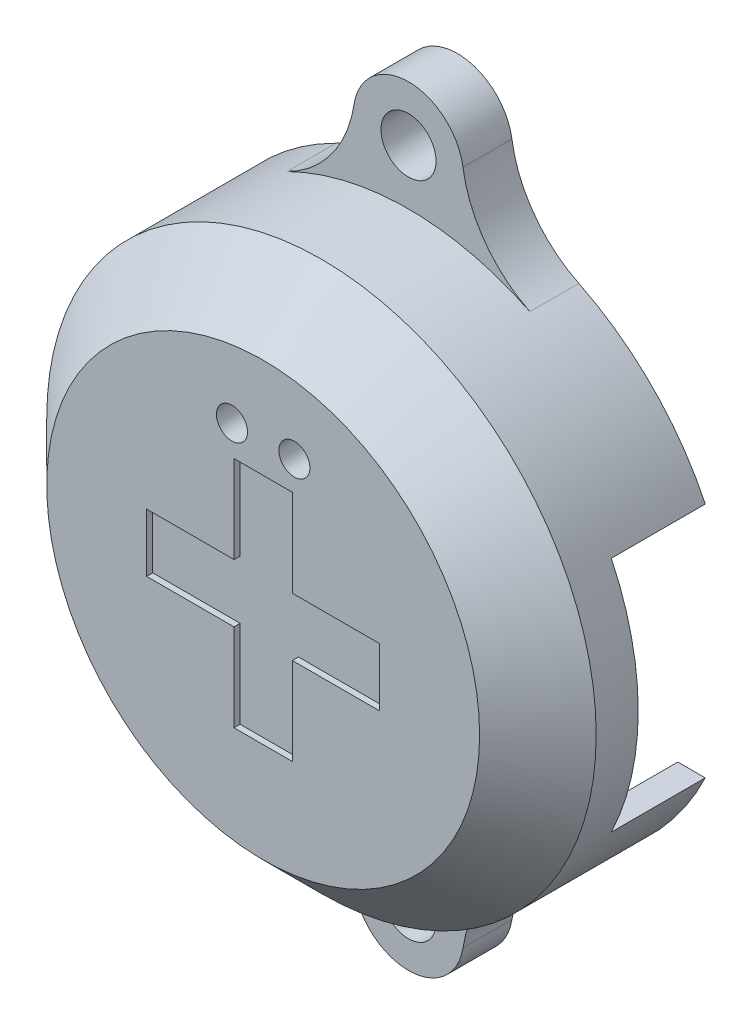
ISO-10303-21;
HEADER;
FILE_DESCRIPTION(('STEP AP214'),'2;1');
FILE_NAME('part.step','',(''),(''),'','','');
FILE_SCHEMA(('AUTOMOTIVE_DESIGN { 1 0 10303 214 1 1 1 1 }'));
ENDSEC;
DATA;
#1=APPLICATION_CONTEXT('core data for automotive mechanical design processes');
#2=APPLICATION_PROTOCOL_DEFINITION('international standard','automotive_design',2000,#1);
#3=PRODUCT_CONTEXT('',#1,'mechanical');
#4=PRODUCT('Part','Part','',(#3));
#5=PRODUCT_RELATED_PRODUCT_CATEGORY('part','',(#4));
#6=PRODUCT_DEFINITION_FORMATION('','',#4);
#7=PRODUCT_DEFINITION_CONTEXT('part definition',#1,'design');
#8=PRODUCT_DEFINITION('design','',#6,#7);
#9=PRODUCT_DEFINITION_SHAPE('','',#8);
#10=(LENGTH_UNIT() NAMED_UNIT(*) SI_UNIT(.MILLI.,.METRE.));
#11=(NAMED_UNIT(*) PLANE_ANGLE_UNIT() SI_UNIT($,.RADIAN.));
#12=(NAMED_UNIT(*) SI_UNIT($,.STERADIAN.) SOLID_ANGLE_UNIT());
#13=UNCERTAINTY_MEASURE_WITH_UNIT(LENGTH_MEASURE(1.E-05),#10,'distance_accuracy_value','');
#14=(GEOMETRIC_REPRESENTATION_CONTEXT(3) GLOBAL_UNCERTAINTY_ASSIGNED_CONTEXT((#13)) GLOBAL_UNIT_ASSIGNED_CONTEXT((#10,
#11,#12)) REPRESENTATION_CONTEXT('',''));
#15=CARTESIAN_POINT('',(0.,0.,0.));
#16=DIRECTION('',(0.,0.,1.));
#17=DIRECTION('',(1.,0.,0.));
#18=AXIS2_PLACEMENT_3D('',#15,#16,#17);
#19=CARTESIAN_POINT('',(0.,0.,0.));
#20=DIRECTION('',(0.,0.,1.));
#21=DIRECTION('',(1.,0.,0.));
#22=AXIS2_PLACEMENT_3D('',#19,#20,#21);
#23=PLANE('',#22);
#24=CARTESIAN_POINT('',(0.,-26.95,0.));
#25=DIRECTION('',(0.,0.,1.));
#26=DIRECTION('',(1.,0.,0.));
#27=AXIS2_PLACEMENT_3D('',#24,#25,#26);
#28=CIRCLE('',#27,2.25);
#29=CARTESIAN_POINT('',(2.25,-26.95,0.));
#30=VERTEX_POINT('',#29);
#31=EDGE_CURVE('E448',#30,#30,#28,.T.);
#32=ORIENTED_EDGE('',*,*,#31,.T.);
#33=EDGE_LOOP('',(#32));
#34=FACE_BOUND('',#33,.T.);
#35=CARTESIAN_POINT('',(-6.60464318228082E-12,3.48582322548716E-13,0.));
#36=DIRECTION('',(0.,0.,1.));
#37=DIRECTION('',(1.,0.,0.));
#38=AXIS2_PLACEMENT_3D('',#35,#36,#37);
#39=CIRCLE('',#38,22.45);
#40=CARTESIAN_POINT('',(-20.2515623841763,-9.68900000000403,0.));
#41=VERTEX_POINT('',#40);
#42=CARTESIAN_POINT('',(-9.9196082532792,-20.1396095320042,0.));
#43=VERTEX_POINT('',#42);
#44=EDGE_CURVE('E273',#41,#43,#39,.T.);
#45=ORIENTED_EDGE('',*,*,#44,.F.);
#46=DIRECTION('',(1.,0.,0.));
#47=VECTOR('',#46,1.);
#48=CARTESIAN_POINT('',(-22.4500000000066,-9.68900000000403,0.));
#49=LINE('',#48,#47);
#50=CARTESIAN_POINT('',(-18.0090471430377,-9.68900000000403,0.));
#51=VERTEX_POINT('',#50);
#52=EDGE_CURVE('E333',#41,#51,#49,.T.);
#53=ORIENTED_EDGE('',*,*,#52,.T.);
#54=CARTESIAN_POINT('',(-6.60464318228082E-12,3.48582322548716E-13,0.));
#55=DIRECTION('',(0.,0.,1.));
#56=DIRECTION('',(1.,0.,0.));
#57=AXIS2_PLACEMENT_3D('',#54,#55,#56);
#58=CIRCLE('',#57,20.45);
#59=CARTESIAN_POINT('',(18.0090471430245,-9.68900000000403,0.));
#60=VERTEX_POINT('',#59);
#61=EDGE_CURVE('E415',#51,#60,#58,.T.);
#62=ORIENTED_EDGE('',*,*,#61,.T.);
#63=CARTESIAN_POINT('',(20.251562384163,-9.68900000000403,0.));
#64=VERTEX_POINT('',#63);
#65=EDGE_CURVE('E320',#60,#64,#49,.T.);
#66=ORIENTED_EDGE('',*,*,#65,.T.);
#67=CARTESIAN_POINT('',(-6.60464318228082E-12,3.48582322548716E-13,0.));
#68=DIRECTION('',(0.,0.,1.));
#69=DIRECTION('',(1.,0.,0.));
#70=AXIS2_PLACEMENT_3D('',#67,#68,#69);
#71=CIRCLE('',#70,22.45);
#72=CARTESIAN_POINT('',(9.91960825326625,-20.139609532004,0.));
#73=VERTEX_POINT('',#72);
#74=EDGE_CURVE('E479',#73,#64,#71,.T.);
#75=ORIENTED_EDGE('',*,*,#74,.F.);
#76=CARTESIAN_POINT('',(14.3381419963722,-29.1104823747677,0.));
#77=DIRECTION('',(0.,0.,1.));
#78=DIRECTION('',(1.,0.,0.));
#79=AXIS2_PLACEMENT_3D('',#76,#77,#78);
#80=CIRCLE('',#79,10.);
#81=CARTESIAN_POINT('',(4.44976820576625,-27.6204945301001,0.));
#82=VERTEX_POINT('',#81);
#83=EDGE_CURVE('E468',#73,#82,#80,.T.);
#84=ORIENTED_EDGE('',*,*,#83,.T.);
#85=CARTESIAN_POINT('',(-6.42729412120925E-12,-26.9499999999997,0.));
#86=DIRECTION('',(0.,0.,1.));
#87=DIRECTION('',(1.,0.,0.));
#88=AXIS2_PLACEMENT_3D('',#85,#86,#87);
#89=CIRCLE('',#88,4.5);
#90=CARTESIAN_POINT('',(-4.4497682057791,-27.6204945301001,0.));
#91=VERTEX_POINT('',#90);
#92=EDGE_CURVE('E276',#91,#82,#89,.T.);
#93=ORIENTED_EDGE('',*,*,#92,.F.);
#94=CARTESIAN_POINT('',(-14.338141996385,-29.1104823747678,0.));
#95=DIRECTION('',(0.,0.,1.));
#96=DIRECTION('',(1.,0.,0.));
#97=AXIS2_PLACEMENT_3D('',#94,#95,#96);
#98=CIRCLE('',#97,9.99999999999999);
#99=EDGE_CURVE('E272',#91,#43,#98,.T.);
#100=ORIENTED_EDGE('',*,*,#99,.T.);
#101=EDGE_LOOP('',(#45,#53,#62,#66,#75,#84,#93,#100));
#102=FACE_BOUND('',#101,.T.);
#103=ADVANCED_FACE('F58',(#34,#102),#23,.F.);
#104=CARTESIAN_POINT('',(20.2515623841672,9.68899999999595,0.));
#105=VERTEX_POINT('',#104);
#106=CARTESIAN_POINT('',(9.91960825326599,20.1396095320049,0.));
#107=VERTEX_POINT('',#106);
#108=EDGE_CURVE('E478',#105,#107,#71,.T.);
#109=ORIENTED_EDGE('',*,*,#108,.F.);
#110=DIRECTION('',(1.,0.,0.));
#111=VECTOR('',#110,1.);
#112=CARTESIAN_POINT('',(-22.4500000000066,9.68899999999596,0.));
#113=LINE('',#112,#111);
#114=CARTESIAN_POINT('',(18.0090471430292,9.68899999999595,0.));
#115=VERTEX_POINT('',#114);
#116=EDGE_CURVE('E266',#115,#105,#113,.T.);
#117=ORIENTED_EDGE('',*,*,#116,.F.);
#118=CARTESIAN_POINT('',(-18.0090471430424,9.68899999999596,0.));
#119=VERTEX_POINT('',#118);
#120=EDGE_CURVE('E265',#115,#119,#58,.T.);
#121=ORIENTED_EDGE('',*,*,#120,.T.);
#122=CARTESIAN_POINT('',(-20.2515623841805,9.68899999999595,0.));
#123=VERTEX_POINT('',#122);
#124=EDGE_CURVE('E84',#123,#119,#113,.T.);
#125=ORIENTED_EDGE('',*,*,#124,.F.);
#126=CARTESIAN_POINT('',(-9.91960825327948,20.1396095320047,0.));
#127=VERTEX_POINT('',#126);
#128=EDGE_CURVE('E261',#127,#123,#39,.T.);
#129=ORIENTED_EDGE('',*,*,#128,.F.);
#130=CARTESIAN_POINT('',(-14.3381419963854,29.1104823747683,0.));
#131=DIRECTION('',(0.,0.,1.));
#132=DIRECTION('',(1.,0.,0.));
#133=AXIS2_PLACEMENT_3D('',#130,#131,#132);
#134=CIRCLE('',#133,10.);
#135=CARTESIAN_POINT('',(-4.44976820577948,27.6204945301008,0.));
#136=VERTEX_POINT('',#135);
#137=EDGE_CURVE('E278',#127,#136,#134,.T.);
#138=ORIENTED_EDGE('',*,*,#137,.T.);
#139=CARTESIAN_POINT('',(-6.79531640052712E-12,26.9500000000004,0.));
#140=DIRECTION('',(0.,0.,1.));
#141=DIRECTION('',(1.,0.,0.));
#142=AXIS2_PLACEMENT_3D('',#139,#140,#141);
#143=CIRCLE('',#142,4.5);
#144=CARTESIAN_POINT('',(4.44976820576588,27.6204945301008,0.));
#145=VERTEX_POINT('',#144);
#146=EDGE_CURVE('E483',#145,#136,#143,.T.);
#147=ORIENTED_EDGE('',*,*,#146,.F.);
#148=CARTESIAN_POINT('',(14.3381419963718,29.1104823747685,0.));
#149=DIRECTION('',(0.,0.,1.));
#150=DIRECTION('',(1.,0.,0.));
#151=AXIS2_PLACEMENT_3D('',#148,#149,#150);
#152=CIRCLE('',#151,9.99999999999999);
#153=EDGE_CURVE('E481',#145,#107,#152,.T.);
#154=ORIENTED_EDGE('',*,*,#153,.T.);
#155=EDGE_LOOP('',(#109,#117,#121,#125,#129,#138,#147,#154));
#156=FACE_BOUND('',#155,.T.);
#157=CARTESIAN_POINT('',(-6.79531640052712E-12,26.9500000000004,0.));
#158=DIRECTION('',(0.,0.,1.));
#159=DIRECTION('',(1.,0.,0.));
#160=AXIS2_PLACEMENT_3D('',#157,#158,#159);
#161=CIRCLE('',#160,2.25);
#162=CARTESIAN_POINT('',(2.2499999999932,26.9500000000004,0.));
#163=VERTEX_POINT('',#162);
#164=EDGE_CURVE('E454',#163,#163,#161,.T.);
#165=ORIENTED_EDGE('',*,*,#164,.T.);
#166=EDGE_LOOP('',(#165));
#167=FACE_BOUND('',#166,.T.);
#168=ADVANCED_FACE('F258',(#156,#167),#23,.F.);
#169=CARTESIAN_POINT('',(14.3381419963722,-29.1104823747677,15.875));
#170=DIRECTION('',(0.,0.,-1.));
#171=DIRECTION('',(-1.,0.,0.));
#172=AXIS2_PLACEMENT_3D('',#169,#170,#171);
#173=CYLINDRICAL_SURFACE('',#172,10.);
#174=DIRECTION('',(0.,0.,-1.));
#175=VECTOR('',#174,1.);
#176=CARTESIAN_POINT('',(9.91960825326625,-20.139609532004,15.875));
#177=LINE('',#176,#175);
#178=CARTESIAN_POINT('',(9.91960825326625,-20.139609532004,4.));
#179=VERTEX_POINT('',#178);
#180=EDGE_CURVE('E299',#179,#73,#177,.T.);
#181=ORIENTED_EDGE('',*,*,#180,.F.);
#182=CARTESIAN_POINT('',(14.3381419963722,-29.1104823747677,4.));
#183=DIRECTION('',(0.,0.,1.));
#184=DIRECTION('',(1.,0.,0.));
#185=AXIS2_PLACEMENT_3D('',#182,#183,#184);
#186=CIRCLE('',#185,10.);
#187=CARTESIAN_POINT('',(4.44976820576625,-27.6204945301001,4.));
#188=VERTEX_POINT('',#187);
#189=EDGE_CURVE('E465',#188,#179,#186,.F.);
#190=ORIENTED_EDGE('',*,*,#189,.F.);
#191=DIRECTION('',(0.,0.,-1.));
#192=VECTOR('',#191,1.);
#193=CARTESIAN_POINT('',(4.44976820576625,-27.6204945301001,15.875));
#194=LINE('',#193,#192);
#195=EDGE_CURVE('E284',#188,#82,#194,.T.);
#196=ORIENTED_EDGE('',*,*,#195,.T.);
#197=ORIENTED_EDGE('',*,*,#83,.F.);
#198=EDGE_LOOP('',(#181,#190,#196,#197));
#199=FACE_BOUND('',#198,.T.);
#200=ADVANCED_FACE('F532',(#199),#173,.F.);
#201=CARTESIAN_POINT('',(14.3381419963718,29.1104823747685,15.875));
#202=DIRECTION('',(0.,0.,-1.));
#203=DIRECTION('',(-1.,0.,0.));
#204=AXIS2_PLACEMENT_3D('',#201,#202,#203);
#205=CYLINDRICAL_SURFACE('',#204,9.99999999999999);
#206=DIRECTION('',(0.,0.,-1.));
#207=VECTOR('',#206,1.);
#208=CARTESIAN_POINT('',(4.44976820576588,27.6204945301008,15.875));
#209=LINE('',#208,#207);
#210=CARTESIAN_POINT('',(4.44976820576588,27.6204945301008,4.));
#211=VERTEX_POINT('',#210);
#212=EDGE_CURVE('E294',#211,#145,#209,.T.);
#213=ORIENTED_EDGE('',*,*,#212,.F.);
#214=CARTESIAN_POINT('',(14.3381419963718,29.1104823747685,4.));
#215=DIRECTION('',(0.,0.,1.));
#216=DIRECTION('',(1.,0.,0.));
#217=AXIS2_PLACEMENT_3D('',#214,#215,#216);
#218=CIRCLE('',#217,9.99999999999999);
#219=CARTESIAN_POINT('',(9.91960825326599,20.1396095320049,4.));
#220=VERTEX_POINT('',#219);
#221=EDGE_CURVE('E470',#220,#211,#218,.F.);
#222=ORIENTED_EDGE('',*,*,#221,.F.);
#223=DIRECTION('',(0.,0.,-1.));
#224=VECTOR('',#223,1.);
#225=CARTESIAN_POINT('',(9.91960825326599,20.1396095320049,15.875));
#226=LINE('',#225,#224);
#227=EDGE_CURVE('E296',#220,#107,#226,.T.);
#228=ORIENTED_EDGE('',*,*,#227,.T.);
#229=ORIENTED_EDGE('',*,*,#153,.F.);
#230=EDGE_LOOP('',(#213,#222,#228,#229));
#231=FACE_BOUND('',#230,.T.);
#232=ADVANCED_FACE('F498',(#231),#205,.F.);
#233=CARTESIAN_POINT('',(-6.79531640052712E-12,26.9500000000004,15.875));
#234=DIRECTION('',(0.,0.,-1.));
#235=DIRECTION('',(-1.,0.,0.));
#236=AXIS2_PLACEMENT_3D('',#233,#234,#235);
#237=CYLINDRICAL_SURFACE('',#236,4.5);
#238=CARTESIAN_POINT('',(-6.79531640052712E-12,26.9500000000004,4.));
#239=DIRECTION('',(0.,0.,1.));
#240=DIRECTION('',(1.,0.,0.));
#241=AXIS2_PLACEMENT_3D('',#238,#239,#240);
#242=CIRCLE('',#241,4.5);
#243=CARTESIAN_POINT('',(-4.44976820577947,27.6204945301008,4.));
#244=VERTEX_POINT('',#243);
#245=EDGE_CURVE('E472',#211,#244,#242,.T.);
#246=ORIENTED_EDGE('',*,*,#245,.F.);
#247=ORIENTED_EDGE('',*,*,#212,.T.);
#248=ORIENTED_EDGE('',*,*,#146,.T.);
#249=DIRECTION('',(0.,0.,-1.));
#250=VECTOR('',#249,1.);
#251=CARTESIAN_POINT('',(-4.44976820577948,27.6204945301008,15.875));
#252=LINE('',#251,#250);
#253=EDGE_CURVE('E292',#244,#136,#252,.T.);
#254=ORIENTED_EDGE('',*,*,#253,.F.);
#255=EDGE_LOOP('',(#246,#247,#248,#254));
#256=FACE_BOUND('',#255,.T.);
#257=ADVANCED_FACE('F493',(#256),#237,.T.);
#258=CARTESIAN_POINT('',(-14.3381419963854,29.1104823747683,15.875));
#259=DIRECTION('',(0.,0.,-1.));
#260=DIRECTION('',(-1.,0.,0.));
#261=AXIS2_PLACEMENT_3D('',#258,#259,#260);
#262=CYLINDRICAL_SURFACE('',#261,10.);
#263=DIRECTION('',(0.,0.,-1.));
#264=VECTOR('',#263,1.);
#265=CARTESIAN_POINT('',(-9.91960825327948,20.1396095320047,15.875));
#266=LINE('',#265,#264);
#267=CARTESIAN_POINT('',(-9.91960825327948,20.1396095320047,4.));
#268=VERTEX_POINT('',#267);
#269=EDGE_CURVE('E271',#268,#127,#266,.T.);
#270=ORIENTED_EDGE('',*,*,#269,.F.);
#271=CARTESIAN_POINT('',(-14.3381419963854,29.1104823747683,4.));
#272=DIRECTION('',(0.,0.,1.));
#273=DIRECTION('',(1.,0.,0.));
#274=AXIS2_PLACEMENT_3D('',#271,#272,#273);
#275=CIRCLE('',#274,10.);
#276=EDGE_CURVE('E461',#244,#268,#275,.F.);
#277=ORIENTED_EDGE('',*,*,#276,.F.);
#278=ORIENTED_EDGE('',*,*,#253,.T.);
#279=ORIENTED_EDGE('',*,*,#137,.F.);
#280=EDGE_LOOP('',(#270,#277,#278,#279));
#281=FACE_BOUND('',#280,.T.);
#282=ADVANCED_FACE('F490',(#281),#262,.F.);
#283=CARTESIAN_POINT('',(-14.338141996385,-29.1104823747678,15.875));
#284=DIRECTION('',(0.,0.,-1.));
#285=DIRECTION('',(-1.,0.,0.));
#286=AXIS2_PLACEMENT_3D('',#283,#284,#285);
#287=CYLINDRICAL_SURFACE('',#286,9.99999999999999);
#288=DIRECTION('',(0.,0.,-1.));
#289=VECTOR('',#288,1.);
#290=CARTESIAN_POINT('',(-4.4497682057791,-27.6204945301001,15.875));
#291=LINE('',#290,#289);
#292=CARTESIAN_POINT('',(-4.4497682057791,-27.6204945301001,4.));
#293=VERTEX_POINT('',#292);
#294=EDGE_CURVE('E286',#293,#91,#291,.T.);
#295=ORIENTED_EDGE('',*,*,#294,.F.);
#296=CARTESIAN_POINT('',(-14.338141996385,-29.1104823747678,4.));
#297=DIRECTION('',(0.,0.,1.));
#298=DIRECTION('',(1.,0.,0.));
#299=AXIS2_PLACEMENT_3D('',#296,#297,#298);
#300=CIRCLE('',#299,9.99999999999999);
#301=CARTESIAN_POINT('',(-9.91960825327921,-20.1396095320042,4.));
#302=VERTEX_POINT('',#301);
#303=EDGE_CURVE('E460',#302,#293,#300,.F.);
#304=ORIENTED_EDGE('',*,*,#303,.F.);
#305=DIRECTION('',(0.,0.,-1.));
#306=VECTOR('',#305,1.);
#307=CARTESIAN_POINT('',(-9.9196082532792,-20.1396095320042,15.875));
#308=LINE('',#307,#306);
#309=EDGE_CURVE('E288',#302,#43,#308,.T.);
#310=ORIENTED_EDGE('',*,*,#309,.T.);
#311=ORIENTED_EDGE('',*,*,#99,.F.);
#312=EDGE_LOOP('',(#295,#304,#310,#311));
#313=FACE_BOUND('',#312,.T.);
#314=ADVANCED_FACE('F539',(#313),#287,.F.);
#315=CARTESIAN_POINT('',(-6.42729412120925E-12,-26.9499999999997,15.875));
#316=DIRECTION('',(0.,0.,-1.));
#317=DIRECTION('',(-1.,0.,0.));
#318=AXIS2_PLACEMENT_3D('',#315,#316,#317);
#319=CYLINDRICAL_SURFACE('',#318,4.5);
#320=CARTESIAN_POINT('',(-6.42729412120925E-12,-26.9499999999997,4.));
#321=DIRECTION('',(0.,0.,1.));
#322=DIRECTION('',(1.,0.,0.));
#323=AXIS2_PLACEMENT_3D('',#320,#321,#322);
#324=CIRCLE('',#323,4.5);
#325=EDGE_CURVE('E463',#293,#188,#324,.T.);
#326=ORIENTED_EDGE('',*,*,#325,.F.);
#327=ORIENTED_EDGE('',*,*,#294,.T.);
#328=ORIENTED_EDGE('',*,*,#92,.T.);
#329=ORIENTED_EDGE('',*,*,#195,.F.);
#330=EDGE_LOOP('',(#326,#327,#328,#329));
#331=FACE_BOUND('',#330,.T.);
#332=ADVANCED_FACE('F544',(#331),#319,.T.);
#333=CARTESIAN_POINT('',(0.,0.,15.875));
#334=DIRECTION('',(0.,0.,1.));
#335=DIRECTION('',(1.,0.,0.));
#336=AXIS2_PLACEMENT_3D('',#333,#334,#335);
#337=PLANE('',#336);
#338=CARTESIAN_POINT('',(2.55000000000583,11.9500000000043,15.875));
#339=DIRECTION('',(0.,0.,1.));
#340=DIRECTION('',(1.,0.,0.));
#341=AXIS2_PLACEMENT_3D('',#338,#339,#340);
#342=CIRCLE('',#341,1.26999999999451);
#343=CARTESIAN_POINT('',(3.82000000000034,11.9500000000043,15.875));
#344=VERTEX_POINT('',#343);
#345=EDGE_CURVE('E316',#344,#344,#342,.T.);
#346=ORIENTED_EDGE('',*,*,#345,.F.);
#347=EDGE_LOOP('',(#346));
#348=FACE_BOUND('',#347,.T.);
#349=CARTESIAN_POINT('',(-2.54999999999417,11.9500000000043,15.875));
#350=DIRECTION('',(0.,0.,1.));
#351=DIRECTION('',(1.,0.,0.));
#352=AXIS2_PLACEMENT_3D('',#349,#350,#351);
#353=CIRCLE('',#352,1.26999999999451);
#354=CARTESIAN_POINT('',(-1.27999999999966,11.9500000000043,15.875));
#355=VERTEX_POINT('',#354);
#356=EDGE_CURVE('E322',#355,#355,#353,.T.);
#357=ORIENTED_EDGE('',*,*,#356,.F.);
#358=EDGE_LOOP('',(#357));
#359=FACE_BOUND('',#358,.T.);
#360=DIRECTION('',(1.,0.,0.));
#361=VECTOR('',#360,1.);
#362=CARTESIAN_POINT('',(0.,-2.38125,15.875));
#363=LINE('',#362,#361);
#364=CARTESIAN_POINT('',(-9.525,-2.38125,15.875));
#365=VERTEX_POINT('',#364);
#366=CARTESIAN_POINT('',(-2.38125,-2.38125,15.875));
#367=VERTEX_POINT('',#366);
#368=EDGE_CURVE('E347',#365,#367,#363,.T.);
#369=ORIENTED_EDGE('',*,*,#368,.F.);
#370=DIRECTION('',(0.,-1.,0.));
#371=VECTOR('',#370,1.);
#372=CARTESIAN_POINT('',(-9.525,0.,15.875));
#373=LINE('',#372,#371);
#374=CARTESIAN_POINT('',(-9.525,2.38125,15.875));
#375=VERTEX_POINT('',#374);
#376=EDGE_CURVE('E352',#375,#365,#373,.T.);
#377=ORIENTED_EDGE('',*,*,#376,.F.);
#378=DIRECTION('',(1.,0.,0.));
#379=VECTOR('',#378,1.);
#380=CARTESIAN_POINT('',(0.,2.38125,15.875));
#381=LINE('',#380,#379);
#382=CARTESIAN_POINT('',(-2.38125,2.38125,15.875));
#383=VERTEX_POINT('',#382);
#384=EDGE_CURVE('E408',#375,#383,#381,.T.);
#385=ORIENTED_EDGE('',*,*,#384,.T.);
#386=DIRECTION('',(0.,-1.,0.));
#387=VECTOR('',#386,1.);
#388=CARTESIAN_POINT('',(-2.38125,0.,15.875));
#389=LINE('',#388,#387);
#390=CARTESIAN_POINT('',(-2.38125,9.525,15.875));
#391=VERTEX_POINT('',#390);
#392=EDGE_CURVE('E405',#391,#383,#389,.T.);
#393=ORIENTED_EDGE('',*,*,#392,.F.);
#394=DIRECTION('',(1.,0.,0.));
#395=VECTOR('',#394,1.);
#396=CARTESIAN_POINT('',(0.,9.525,15.875));
#397=LINE('',#396,#395);
#398=CARTESIAN_POINT('',(2.38125,9.525,15.875));
#399=VERTEX_POINT('',#398);
#400=EDGE_CURVE('E402',#391,#399,#397,.T.);
#401=ORIENTED_EDGE('',*,*,#400,.T.);
#402=DIRECTION('',(0.,-1.,0.));
#403=VECTOR('',#402,1.);
#404=CARTESIAN_POINT('',(2.38125,0.,15.875));
#405=LINE('',#404,#403);
#406=CARTESIAN_POINT('',(2.38125,2.38125,15.875));
#407=VERTEX_POINT('',#406);
#408=EDGE_CURVE('E399',#399,#407,#405,.T.);
#409=ORIENTED_EDGE('',*,*,#408,.T.);
#410=DIRECTION('',(1.,0.,0.));
#411=VECTOR('',#410,1.);
#412=CARTESIAN_POINT('',(0.,2.38125,15.875));
#413=LINE('',#412,#411);
#414=CARTESIAN_POINT('',(9.525,2.38125,15.875));
#415=VERTEX_POINT('',#414);
#416=EDGE_CURVE('E396',#407,#415,#413,.T.);
#417=ORIENTED_EDGE('',*,*,#416,.T.);
#418=DIRECTION('',(0.,-1.,0.));
#419=VECTOR('',#418,1.);
#420=CARTESIAN_POINT('',(9.525,0.,15.875));
#421=LINE('',#420,#419);
#422=CARTESIAN_POINT('',(9.525,-2.38125,15.875));
#423=VERTEX_POINT('',#422);
#424=EDGE_CURVE('E393',#415,#423,#421,.T.);
#425=ORIENTED_EDGE('',*,*,#424,.T.);
#426=DIRECTION('',(1.,0.,0.));
#427=VECTOR('',#426,1.);
#428=CARTESIAN_POINT('',(0.,-2.38125,15.875));
#429=LINE('',#428,#427);
#430=CARTESIAN_POINT('',(2.38125,-2.38125,15.875));
#431=VERTEX_POINT('',#430);
#432=EDGE_CURVE('E390',#431,#423,#429,.T.);
#433=ORIENTED_EDGE('',*,*,#432,.F.);
#434=DIRECTION('',(0.,-1.,0.));
#435=VECTOR('',#434,1.);
#436=CARTESIAN_POINT('',(2.38125,0.,15.875));
#437=LINE('',#436,#435);
#438=CARTESIAN_POINT('',(2.38125,-9.525,15.875));
#439=VERTEX_POINT('',#438);
#440=EDGE_CURVE('E387',#431,#439,#437,.T.);
#441=ORIENTED_EDGE('',*,*,#440,.T.);
#442=DIRECTION('',(1.,0.,0.));
#443=VECTOR('',#442,1.);
#444=CARTESIAN_POINT('',(0.,-9.525,15.875));
#445=LINE('',#444,#443);
#446=CARTESIAN_POINT('',(-2.38125,-9.525,15.875));
#447=VERTEX_POINT('',#446);
#448=EDGE_CURVE('E384',#447,#439,#445,.T.);
#449=ORIENTED_EDGE('',*,*,#448,.F.);
#450=DIRECTION('',(0.,-1.,0.));
#451=VECTOR('',#450,1.);
#452=CARTESIAN_POINT('',(-2.38125,0.,15.875));
#453=LINE('',#452,#451);
#454=EDGE_CURVE('E381',#367,#447,#453,.T.);
#455=ORIENTED_EDGE('',*,*,#454,.F.);
#456=EDGE_LOOP('',(#369,#377,#385,#393,#401,#409,#417,#425,#433,#441,#449,#455));
#457=FACE_BOUND('',#456,.T.);
#458=CARTESIAN_POINT('',(-6.60464318228082E-12,3.48582322548716E-13,15.875));
#459=DIRECTION('',(0.,0.,1.));
#460=DIRECTION('',(1.,0.,0.));
#461=AXIS2_PLACEMENT_3D('',#458,#459,#460);
#462=CIRCLE('',#461,17.6875);
#463=CARTESIAN_POINT('',(17.6874999999934,3.48582322548716E-13,15.875));
#464=VERTEX_POINT('',#463);
#465=EDGE_CURVE('E301',#464,#464,#462,.T.);
#466=ORIENTED_EDGE('',*,*,#465,.T.);
#467=EDGE_LOOP('',(#466));
#468=FACE_BOUND('',#467,.T.);
#469=ADVANCED_FACE('F546',(#348,#359,#457,#468),#337,.T.);
#470=CARTESIAN_POINT('',(-6.60464318228082E-12,3.48582322548716E-13,15.875));
#471=DIRECTION('',(0.,0.,-1.));
#472=DIRECTION('',(-1.,0.,0.));
#473=AXIS2_PLACEMENT_3D('',#470,#471,#472);
#474=CYLINDRICAL_SURFACE('',#473,22.45);
#475=CARTESIAN_POINT('',(-6.60464318228082E-12,3.48582322548716E-13,11.1125));
#476=DIRECTION('',(0.,0.,1.));
#477=DIRECTION('',(1.,0.,0.));
#478=AXIS2_PLACEMENT_3D('',#475,#476,#477);
#479=CIRCLE('',#478,22.45);
#480=CARTESIAN_POINT('',(22.4499999999934,3.48582322548716E-13,11.1125));
#481=VERTEX_POINT('',#480);
#482=EDGE_CURVE('E304',#481,#481,#479,.F.);
#483=ORIENTED_EDGE('',*,*,#482,.T.);
#484=EDGE_LOOP('',(#483));
#485=FACE_BOUND('',#484,.T.);
#486=ORIENTED_EDGE('',*,*,#74,.T.);
#487=DIRECTION('',(0.,0.,-1.));
#488=VECTOR('',#487,1.);
#489=CARTESIAN_POINT('',(20.251562384163,-9.68900000000403,15.875));
#490=LINE('',#489,#488);
#491=CARTESIAN_POINT('',(20.251562384163,-9.68900000000403,7.67679999999568));
#492=VERTEX_POINT('',#491);
#493=EDGE_CURVE('E341',#64,#492,#490,.F.);
#494=ORIENTED_EDGE('',*,*,#493,.T.);
#495=CARTESIAN_POINT('',(-6.60464318228082E-12,3.48582322548716E-13,7.67679999999568));
#496=DIRECTION('',(0.,0.,1.));
#497=DIRECTION('',(0.,-1.,0.));
#498=AXIS2_PLACEMENT_3D('',#495,#496,#497);
#499=CIRCLE('',#498,22.45);
#500=CARTESIAN_POINT('',(20.2515623841672,9.68899999999596,7.67679999999568));
#501=VERTEX_POINT('',#500);
#502=EDGE_CURVE('E339',#492,#501,#499,.T.);
#503=ORIENTED_EDGE('',*,*,#502,.T.);
#504=DIRECTION('',(0.,0.,-1.));
#505=VECTOR('',#504,1.);
#506=CARTESIAN_POINT('',(20.2515623841672,9.68899999999595,15.875));
#507=LINE('',#506,#505);
#508=EDGE_CURVE('E251',#501,#105,#507,.T.);
#509=ORIENTED_EDGE('',*,*,#508,.T.);
#510=ORIENTED_EDGE('',*,*,#108,.T.);
#511=ORIENTED_EDGE('',*,*,#227,.F.);
#512=CARTESIAN_POINT('',(-6.60464318228082E-12,3.48582322548716E-13,4.));
#513=DIRECTION('',(0.,0.,1.));
#514=DIRECTION('',(1.,0.,0.));
#515=AXIS2_PLACEMENT_3D('',#512,#513,#514);
#516=CIRCLE('',#515,22.45);
#517=EDGE_CURVE('E457',#220,#268,#516,.T.);
#518=ORIENTED_EDGE('',*,*,#517,.T.);
#519=ORIENTED_EDGE('',*,*,#269,.T.);
#520=ORIENTED_EDGE('',*,*,#128,.T.);
#521=DIRECTION('',(0.,0.,-1.));
#522=VECTOR('',#521,1.);
#523=CARTESIAN_POINT('',(-20.2515623841805,9.68899999999595,15.875));
#524=LINE('',#523,#522);
#525=CARTESIAN_POINT('',(-20.2515623841805,9.68899999999596,7.67679999999568));
#526=VERTEX_POINT('',#525);
#527=EDGE_CURVE('E245',#123,#526,#524,.F.);
#528=ORIENTED_EDGE('',*,*,#527,.T.);
#529=CARTESIAN_POINT('',(-20.2515623841763,-9.68900000000403,7.67679999999568));
#530=VERTEX_POINT('',#529);
#531=EDGE_CURVE('E338',#526,#530,#499,.T.);
#532=ORIENTED_EDGE('',*,*,#531,.T.);
#533=DIRECTION('',(0.,0.,-1.));
#534=VECTOR('',#533,1.);
#535=CARTESIAN_POINT('',(-20.2515623841763,-9.68900000000403,15.875));
#536=LINE('',#535,#534);
#537=EDGE_CURVE('E344',#530,#41,#536,.T.);
#538=ORIENTED_EDGE('',*,*,#537,.T.);
#539=ORIENTED_EDGE('',*,*,#44,.T.);
#540=ORIENTED_EDGE('',*,*,#309,.F.);
#541=CARTESIAN_POINT('',(-6.60464318228082E-12,3.48582322548716E-13,4.));
#542=DIRECTION('',(0.,0.,1.));
#543=DIRECTION('',(1.,0.,0.));
#544=AXIS2_PLACEMENT_3D('',#541,#542,#543);
#545=CIRCLE('',#544,22.45);
#546=EDGE_CURVE('E458',#302,#179,#545,.T.);
#547=ORIENTED_EDGE('',*,*,#546,.T.);
#548=ORIENTED_EDGE('',*,*,#180,.T.);
#549=EDGE_LOOP('',(#486,#494,#503,#509,#510,#511,#518,#519,#520,#528,#532,#538,#539,#540,#547,#548));
#550=FACE_BOUND('',#549,.T.);
#551=ADVANCED_FACE('F269',(#485,#550),#474,.T.);
#552=CARTESIAN_POINT('',(0.,0.,4.));
#553=DIRECTION('',(0.,0.,1.));
#554=DIRECTION('',(1.,0.,0.));
#555=AXIS2_PLACEMENT_3D('',#552,#553,#554);
#556=PLANE('',#555);
#557=CARTESIAN_POINT('',(-6.79531640052712E-12,26.9500000000004,4.));
#558=DIRECTION('',(0.,0.,1.));
#559=DIRECTION('',(1.,0.,0.));
#560=AXIS2_PLACEMENT_3D('',#557,#558,#559);
#561=CIRCLE('',#560,2.24999999999999);
#562=CARTESIAN_POINT('',(2.24999999999319,26.9500000000004,4.));
#563=VERTEX_POINT('',#562);
#564=EDGE_CURVE('E451',#563,#563,#561,.T.);
#565=ORIENTED_EDGE('',*,*,#564,.F.);
#566=EDGE_LOOP('',(#565));
#567=FACE_BOUND('',#566,.T.);
#568=ORIENTED_EDGE('',*,*,#517,.F.);
#569=ORIENTED_EDGE('',*,*,#221,.T.);
#570=ORIENTED_EDGE('',*,*,#245,.T.);
#571=ORIENTED_EDGE('',*,*,#276,.T.);
#572=EDGE_LOOP('',(#568,#569,#570,#571));
#573=FACE_BOUND('',#572,.T.);
#574=ADVANCED_FACE('F564',(#567,#573),#556,.T.);
#575=CARTESIAN_POINT('',(0.,0.,4.));
#576=DIRECTION('',(0.,0.,1.));
#577=DIRECTION('',(1.,0.,0.));
#578=AXIS2_PLACEMENT_3D('',#575,#576,#577);
#579=PLANE('',#578);
#580=CARTESIAN_POINT('',(0.,-26.95,4.));
#581=DIRECTION('',(0.,0.,1.));
#582=DIRECTION('',(1.,0.,0.));
#583=AXIS2_PLACEMENT_3D('',#580,#581,#582);
#584=CIRCLE('',#583,2.24999999999999);
#585=CARTESIAN_POINT('',(2.24999999999999,-26.95,4.));
#586=VERTEX_POINT('',#585);
#587=EDGE_CURVE('E441',#586,#586,#584,.T.);
#588=ORIENTED_EDGE('',*,*,#587,.F.);
#589=EDGE_LOOP('',(#588));
#590=FACE_BOUND('',#589,.T.);
#591=ORIENTED_EDGE('',*,*,#546,.F.);
#592=ORIENTED_EDGE('',*,*,#303,.T.);
#593=ORIENTED_EDGE('',*,*,#325,.T.);
#594=ORIENTED_EDGE('',*,*,#189,.T.);
#595=EDGE_LOOP('',(#591,#592,#593,#594));
#596=FACE_BOUND('',#595,.T.);
#597=ADVANCED_FACE('F543',(#590,#596),#579,.T.);
#598=CARTESIAN_POINT('',(-6.79531640052712E-12,26.9500000000004,4.));
#599=DIRECTION('',(0.,0.,1.));
#600=DIRECTION('',(1.,0.,0.));
#601=AXIS2_PLACEMENT_3D('',#598,#599,#600);
#602=CYLINDRICAL_SURFACE('',#601,2.24999999999999);
#603=ORIENTED_EDGE('',*,*,#164,.F.);
#604=EDGE_LOOP('',(#603));
#605=FACE_BOUND('',#604,.T.);
#606=ORIENTED_EDGE('',*,*,#564,.T.);
#607=EDGE_LOOP('',(#606));
#608=FACE_BOUND('',#607,.T.);
#609=ADVANCED_FACE('F569',(#605,#608),#602,.F.);
#610=CARTESIAN_POINT('',(0.,-26.95,4.));
#611=DIRECTION('',(0.,0.,1.));
#612=DIRECTION('',(1.,0.,0.));
#613=AXIS2_PLACEMENT_3D('',#610,#611,#612);
#614=CYLINDRICAL_SURFACE('',#613,2.24999999999999);
#615=ORIENTED_EDGE('',*,*,#31,.F.);
#616=EDGE_LOOP('',(#615));
#617=FACE_BOUND('',#616,.T.);
#618=ORIENTED_EDGE('',*,*,#587,.T.);
#619=EDGE_LOOP('',(#618));
#620=FACE_BOUND('',#619,.T.);
#621=ADVANCED_FACE('F573',(#617,#620),#614,.F.);
#622=CARTESIAN_POINT('',(-6.60464318228082E-12,3.48582322548716E-13,15.875));
#623=DIRECTION('',(0.,0.,-1.));
#624=DIRECTION('',(-1.,0.,0.));
#625=AXIS2_PLACEMENT_3D('',#622,#623,#624);
#626=CONICAL_SURFACE('',#625,17.6875,0.785398163397447);
#627=ORIENTED_EDGE('',*,*,#482,.F.);
#628=EDGE_LOOP('',(#627));
#629=FACE_BOUND('',#628,.T.);
#630=ORIENTED_EDGE('',*,*,#465,.F.);
#631=EDGE_LOOP('',(#630));
#632=FACE_BOUND('',#631,.T.);
#633=ADVANCED_FACE('F61',(#629,#632),#626,.T.);
#634=CARTESIAN_POINT('',(0.,0.,13.875));
#635=DIRECTION('',(0.,0.,1.));
#636=DIRECTION('',(1.,0.,0.));
#637=AXIS2_PLACEMENT_3D('',#634,#635,#636);
#638=PLANE('',#637);
#639=CARTESIAN_POINT('',(2.55000000000583,11.9500000000043,13.875));
#640=DIRECTION('',(0.,0.,1.));
#641=DIRECTION('',(1.,0.,0.));
#642=AXIS2_PLACEMENT_3D('',#639,#640,#641);
#643=CIRCLE('',#642,1.26999999999451);
#644=CARTESIAN_POINT('',(3.82000000000034,11.9500000000043,13.875));
#645=VERTEX_POINT('',#644);
#646=EDGE_CURVE('E63',#645,#645,#643,.T.);
#647=ORIENTED_EDGE('',*,*,#646,.T.);
#648=EDGE_LOOP('',(#647));
#649=FACE_BOUND('',#648,.T.);
#650=CARTESIAN_POINT('',(-2.54999999999417,11.9500000000043,13.875));
#651=DIRECTION('',(0.,0.,1.));
#652=DIRECTION('',(1.,0.,0.));
#653=AXIS2_PLACEMENT_3D('',#650,#651,#652);
#654=CIRCLE('',#653,1.26999999999451);
#655=CARTESIAN_POINT('',(-1.27999999999966,11.9500000000043,13.875));
#656=VERTEX_POINT('',#655);
#657=EDGE_CURVE('E314',#656,#656,#654,.T.);
#658=ORIENTED_EDGE('',*,*,#657,.T.);
#659=EDGE_LOOP('',(#658));
#660=FACE_BOUND('',#659,.T.);
#661=CARTESIAN_POINT('',(-6.60464318228082E-12,3.48582322548716E-13,13.875));
#662=DIRECTION('',(0.,0.,1.));
#663=DIRECTION('',(1.,0.,0.));
#664=AXIS2_PLACEMENT_3D('',#661,#662,#663);
#665=CIRCLE('',#664,16.8590728752538);
#666=CARTESIAN_POINT('',(16.8590728752472,3.48582322548716E-13,13.875));
#667=VERTEX_POINT('',#666);
#668=EDGE_CURVE('E442',#667,#667,#665,.T.);
#669=ORIENTED_EDGE('',*,*,#668,.F.);
#670=EDGE_LOOP('',(#669));
#671=FACE_BOUND('',#670,.T.);
#672=ADVANCED_FACE('F585',(#649,#660,#671),#638,.F.);
#673=CARTESIAN_POINT('',(-6.60464318228082E-12,3.48582322548716E-13,15.875));
#674=DIRECTION('',(0.,0.,-1.));
#675=DIRECTION('',(-1.,0.,0.));
#676=AXIS2_PLACEMENT_3D('',#673,#674,#675);
#677=CYLINDRICAL_SURFACE('',#676,20.45);
#678=DIRECTION('',(0.,0.,-1.));
#679=VECTOR('',#678,1.);
#680=CARTESIAN_POINT('',(18.0090471430245,-9.68900000000403,15.875));
#681=LINE('',#680,#679);
#682=CARTESIAN_POINT('',(18.0090471430245,-9.68900000000403,7.67679999999568));
#683=VERTEX_POINT('',#682);
#684=EDGE_CURVE('E12',#60,#683,#681,.F.);
#685=ORIENTED_EDGE('',*,*,#684,.F.);
#686=ORIENTED_EDGE('',*,*,#61,.F.);
#687=DIRECTION('',(0.,0.,-1.));
#688=VECTOR('',#687,1.);
#689=CARTESIAN_POINT('',(-18.0090471430377,-9.68900000000403,15.875));
#690=LINE('',#689,#688);
#691=CARTESIAN_POINT('',(-18.0090471430377,-9.68900000000403,7.67679999999568));
#692=VERTEX_POINT('',#691);
#693=EDGE_CURVE('E311',#692,#51,#690,.T.);
#694=ORIENTED_EDGE('',*,*,#693,.F.);
#695=CARTESIAN_POINT('',(-6.60464318228082E-12,3.48582322548716E-13,7.67679999999568));
#696=DIRECTION('',(0.,0.,1.));
#697=DIRECTION('',(0.,-1.,0.));
#698=AXIS2_PLACEMENT_3D('',#695,#696,#697);
#699=CIRCLE('',#698,20.45);
#700=CARTESIAN_POINT('',(-18.0090471430424,9.68899999999596,7.67679999999568));
#701=VERTEX_POINT('',#700);
#702=EDGE_CURVE('E309',#701,#692,#699,.T.);
#703=ORIENTED_EDGE('',*,*,#702,.F.);
#704=DIRECTION('',(0.,0.,-1.));
#705=VECTOR('',#704,1.);
#706=CARTESIAN_POINT('',(-18.0090471430424,9.68899999999595,15.875));
#707=LINE('',#706,#705);
#708=EDGE_CURVE('E307',#119,#701,#707,.F.);
#709=ORIENTED_EDGE('',*,*,#708,.F.);
#710=ORIENTED_EDGE('',*,*,#120,.F.);
#711=DIRECTION('',(0.,0.,-1.));
#712=VECTOR('',#711,1.);
#713=CARTESIAN_POINT('',(18.0090471430292,9.68899999999595,15.875));
#714=LINE('',#713,#712);
#715=CARTESIAN_POINT('',(18.0090471430292,9.68899999999595,7.67679999999568));
#716=VERTEX_POINT('',#715);
#717=EDGE_CURVE('E313',#716,#115,#714,.T.);
#718=ORIENTED_EDGE('',*,*,#717,.F.);
#719=EDGE_CURVE('E68',#683,#716,#699,.T.);
#720=ORIENTED_EDGE('',*,*,#719,.F.);
#721=EDGE_LOOP('',(#685,#686,#694,#703,#709,#710,#718,#720));
#722=FACE_BOUND('',#721,.T.);
#723=CARTESIAN_POINT('',(-6.60464318228082E-12,3.48582322548716E-13,10.2840728752538));
#724=DIRECTION('',(0.,0.,-1.));
#725=DIRECTION('',(-1.,0.,0.));
#726=AXIS2_PLACEMENT_3D('',#723,#724,#725);
#727=CIRCLE('',#726,20.45);
#728=CARTESIAN_POINT('',(-20.4500000000066,3.48582322548716E-13,10.2840728752538));
#729=VERTEX_POINT('',#728);
#730=EDGE_CURVE('E438',#729,#729,#727,.T.);
#731=ORIENTED_EDGE('',*,*,#730,.F.);
#732=EDGE_LOOP('',(#731));
#733=FACE_BOUND('',#732,.T.);
#734=ADVANCED_FACE('F508',(#722,#733),#677,.F.);
#735=CARTESIAN_POINT('',(-6.60464318228082E-12,3.48582322548716E-13,14.4607864376269));
#736=DIRECTION('',(0.,0.,-1.));
#737=DIRECTION('',(-1.,0.,0.));
#738=AXIS2_PLACEMENT_3D('',#735,#736,#737);
#739=CONICAL_SURFACE('',#738,16.2732864376269,0.785398163397447);
#740=ORIENTED_EDGE('',*,*,#730,.T.);
#741=EDGE_LOOP('',(#740));
#742=FACE_BOUND('',#741,.T.);
#743=ORIENTED_EDGE('',*,*,#668,.T.);
#744=EDGE_LOOP('',(#743));
#745=FACE_BOUND('',#744,.T.);
#746=ADVANCED_FACE('F578',(#742,#745),#739,.F.);
#747=CARTESIAN_POINT('',(0.,-2.38125,15.375));
#748=DIRECTION('',(0.,-1.,0.));
#749=DIRECTION('',(1.,0.,0.));
#750=AXIS2_PLACEMENT_3D('',#747,#748,#749);
#751=PLANE('',#750);
#752=ORIENTED_EDGE('',*,*,#368,.T.);
#753=DIRECTION('',(0.,0.,1.));
#754=VECTOR('',#753,1.);
#755=CARTESIAN_POINT('',(-2.38125,-2.38125,15.375));
#756=LINE('',#755,#754);
#757=CARTESIAN_POINT('',(-2.38125,-2.38125,15.375));
#758=VERTEX_POINT('',#757);
#759=EDGE_CURVE('E379',#758,#367,#756,.T.);
#760=ORIENTED_EDGE('',*,*,#759,.F.);
#761=DIRECTION('',(1.,0.,0.));
#762=VECTOR('',#761,1.);
#763=CARTESIAN_POINT('',(0.,-2.38125,15.375));
#764=LINE('',#763,#762);
#765=CARTESIAN_POINT('',(-9.525,-2.38125,15.375));
#766=VERTEX_POINT('',#765);
#767=EDGE_CURVE('E348',#766,#758,#764,.T.);
#768=ORIENTED_EDGE('',*,*,#767,.F.);
#769=DIRECTION('',(0.,0.,1.));
#770=VECTOR('',#769,1.);
#771=CARTESIAN_POINT('',(-9.525,-2.38125,15.375));
#772=LINE('',#771,#770);
#773=EDGE_CURVE('E413',#766,#365,#772,.T.);
#774=ORIENTED_EDGE('',*,*,#773,.T.);
#775=EDGE_LOOP('',(#752,#760,#768,#774));
#776=FACE_BOUND('',#775,.T.);
#777=ADVANCED_FACE('F581',(#776),#751,.F.);
#778=CARTESIAN_POINT('',(-9.525,0.,15.375));
#779=DIRECTION('',(-1.,0.,0.));
#780=DIRECTION('',(0.,0.,1.));
#781=AXIS2_PLACEMENT_3D('',#778,#779,#780);
#782=PLANE('',#781);
#783=ORIENTED_EDGE('',*,*,#376,.T.);
#784=ORIENTED_EDGE('',*,*,#773,.F.);
#785=DIRECTION('',(0.,-1.,0.));
#786=VECTOR('',#785,1.);
#787=CARTESIAN_POINT('',(-9.525,0.,15.375));
#788=LINE('',#787,#786);
#789=CARTESIAN_POINT('',(-9.525,2.38125,15.375));
#790=VERTEX_POINT('',#789);
#791=EDGE_CURVE('E376',#790,#766,#788,.T.);
#792=ORIENTED_EDGE('',*,*,#791,.F.);
#793=DIRECTION('',(0.,0.,1.));
#794=VECTOR('',#793,1.);
#795=CARTESIAN_POINT('',(-9.525,2.38125,15.375));
#796=LINE('',#795,#794);
#797=EDGE_CURVE('E416',#790,#375,#796,.T.);
#798=ORIENTED_EDGE('',*,*,#797,.T.);
#799=EDGE_LOOP('',(#783,#784,#792,#798));
#800=FACE_BOUND('',#799,.T.);
#801=ADVANCED_FACE('F591',(#800),#782,.F.);
#802=CARTESIAN_POINT('',(0.,2.38125,15.375));
#803=DIRECTION('',(0.,-1.,0.));
#804=DIRECTION('',(0.,0.,-1.));
#805=AXIS2_PLACEMENT_3D('',#802,#803,#804);
#806=PLANE('',#805);
#807=ORIENTED_EDGE('',*,*,#384,.F.);
#808=ORIENTED_EDGE('',*,*,#797,.F.);
#809=DIRECTION('',(1.,0.,0.));
#810=VECTOR('',#809,1.);
#811=CARTESIAN_POINT('',(0.,2.38125,15.375));
#812=LINE('',#811,#810);
#813=CARTESIAN_POINT('',(-2.38125,2.38125,15.375));
#814=VERTEX_POINT('',#813);
#815=EDGE_CURVE('E374',#790,#814,#812,.T.);
#816=ORIENTED_EDGE('',*,*,#815,.T.);
#817=DIRECTION('',(0.,0.,1.));
#818=VECTOR('',#817,1.);
#819=CARTESIAN_POINT('',(-2.38125,2.38125,15.375));
#820=LINE('',#819,#818);
#821=EDGE_CURVE('E418',#814,#383,#820,.T.);
#822=ORIENTED_EDGE('',*,*,#821,.T.);
#823=EDGE_LOOP('',(#807,#808,#816,#822));
#824=FACE_BOUND('',#823,.T.);
#825=ADVANCED_FACE('F629',(#824),#806,.T.);
#826=CARTESIAN_POINT('',(-2.38125,0.,15.375));
#827=DIRECTION('',(-1.,0.,0.));
#828=DIRECTION('',(0.,-1.,0.));
#829=AXIS2_PLACEMENT_3D('',#826,#827,#828);
#830=PLANE('',#829);
#831=ORIENTED_EDGE('',*,*,#392,.T.);
#832=ORIENTED_EDGE('',*,*,#821,.F.);
#833=DIRECTION('',(0.,-1.,0.));
#834=VECTOR('',#833,1.);
#835=CARTESIAN_POINT('',(-2.38125,0.,15.375));
#836=LINE('',#835,#834);
#837=CARTESIAN_POINT('',(-2.38125,9.525,15.375));
#838=VERTEX_POINT('',#837);
#839=EDGE_CURVE('E371',#838,#814,#836,.T.);
#840=ORIENTED_EDGE('',*,*,#839,.F.);
#841=DIRECTION('',(0.,0.,1.));
#842=VECTOR('',#841,1.);
#843=CARTESIAN_POINT('',(-2.38125,9.525,15.375));
#844=LINE('',#843,#842);
#845=EDGE_CURVE('E420',#838,#391,#844,.T.);
#846=ORIENTED_EDGE('',*,*,#845,.T.);
#847=EDGE_LOOP('',(#831,#832,#840,#846));
#848=FACE_BOUND('',#847,.T.);
#849=ADVANCED_FACE('F625',(#848),#830,.F.);
#850=CARTESIAN_POINT('',(0.,9.525,15.375));
#851=DIRECTION('',(0.,-1.,0.));
#852=DIRECTION('',(0.,0.,-1.));
#853=AXIS2_PLACEMENT_3D('',#850,#851,#852);
#854=PLANE('',#853);
#855=ORIENTED_EDGE('',*,*,#400,.F.);
#856=ORIENTED_EDGE('',*,*,#845,.F.);
#857=DIRECTION('',(1.,0.,0.));
#858=VECTOR('',#857,1.);
#859=CARTESIAN_POINT('',(0.,9.525,15.375));
#860=LINE('',#859,#858);
#861=CARTESIAN_POINT('',(2.38125,9.525,15.375));
#862=VERTEX_POINT('',#861);
#863=EDGE_CURVE('E369',#838,#862,#860,.T.);
#864=ORIENTED_EDGE('',*,*,#863,.T.);
#865=DIRECTION('',(0.,0.,1.));
#866=VECTOR('',#865,1.);
#867=CARTESIAN_POINT('',(2.38125,9.525,15.375));
#868=LINE('',#867,#866);
#869=EDGE_CURVE('E422',#862,#399,#868,.T.);
#870=ORIENTED_EDGE('',*,*,#869,.T.);
#871=EDGE_LOOP('',(#855,#856,#864,#870));
#872=FACE_BOUND('',#871,.T.);
#873=ADVANCED_FACE('F621',(#872),#854,.T.);
#874=CARTESIAN_POINT('',(2.38125,0.,15.375));
#875=DIRECTION('',(-1.,0.,0.));
#876=DIRECTION('',(0.,-1.,0.));
#877=AXIS2_PLACEMENT_3D('',#874,#875,#876);
#878=PLANE('',#877);
#879=ORIENTED_EDGE('',*,*,#408,.F.);
#880=ORIENTED_EDGE('',*,*,#869,.F.);
#881=DIRECTION('',(0.,-1.,0.));
#882=VECTOR('',#881,1.);
#883=CARTESIAN_POINT('',(2.38125,0.,15.375));
#884=LINE('',#883,#882);
#885=CARTESIAN_POINT('',(2.38125,2.38125,15.375));
#886=VERTEX_POINT('',#885);
#887=EDGE_CURVE('E367',#862,#886,#884,.T.);
#888=ORIENTED_EDGE('',*,*,#887,.T.);
#889=DIRECTION('',(0.,0.,1.));
#890=VECTOR('',#889,1.);
#891=CARTESIAN_POINT('',(2.38125,2.38125,15.375));
#892=LINE('',#891,#890);
#893=EDGE_CURVE('E424',#886,#407,#892,.T.);
#894=ORIENTED_EDGE('',*,*,#893,.T.);
#895=EDGE_LOOP('',(#879,#880,#888,#894));
#896=FACE_BOUND('',#895,.T.);
#897=ADVANCED_FACE('F617',(#896),#878,.T.);
#898=CARTESIAN_POINT('',(0.,2.38125,15.375));
#899=DIRECTION('',(0.,-1.,0.));
#900=DIRECTION('',(0.,0.,-1.));
#901=AXIS2_PLACEMENT_3D('',#898,#899,#900);
#902=PLANE('',#901);
#903=ORIENTED_EDGE('',*,*,#416,.F.);
#904=ORIENTED_EDGE('',*,*,#893,.F.);
#905=DIRECTION('',(1.,0.,0.));
#906=VECTOR('',#905,1.);
#907=CARTESIAN_POINT('',(0.,2.38125,15.375));
#908=LINE('',#907,#906);
#909=CARTESIAN_POINT('',(9.525,2.38125,15.375));
#910=VERTEX_POINT('',#909);
#911=EDGE_CURVE('E365',#886,#910,#908,.T.);
#912=ORIENTED_EDGE('',*,*,#911,.T.);
#913=DIRECTION('',(0.,0.,1.));
#914=VECTOR('',#913,1.);
#915=CARTESIAN_POINT('',(9.525,2.38125,15.375));
#916=LINE('',#915,#914);
#917=EDGE_CURVE('E426',#910,#415,#916,.T.);
#918=ORIENTED_EDGE('',*,*,#917,.T.);
#919=EDGE_LOOP('',(#903,#904,#912,#918));
#920=FACE_BOUND('',#919,.T.);
#921=ADVANCED_FACE('F613',(#920),#902,.T.);
#922=CARTESIAN_POINT('',(9.525,0.,15.375));
#923=DIRECTION('',(-1.,0.,0.));
#924=DIRECTION('',(0.,0.,1.));
#925=AXIS2_PLACEMENT_3D('',#922,#923,#924);
#926=PLANE('',#925);
#927=ORIENTED_EDGE('',*,*,#424,.F.);
#928=ORIENTED_EDGE('',*,*,#917,.F.);
#929=DIRECTION('',(0.,-1.,0.));
#930=VECTOR('',#929,1.);
#931=CARTESIAN_POINT('',(9.525,0.,15.375));
#932=LINE('',#931,#930);
#933=CARTESIAN_POINT('',(9.525,-2.38125,15.375));
#934=VERTEX_POINT('',#933);
#935=EDGE_CURVE('E363',#910,#934,#932,.T.);
#936=ORIENTED_EDGE('',*,*,#935,.T.);
#937=DIRECTION('',(0.,0.,1.));
#938=VECTOR('',#937,1.);
#939=CARTESIAN_POINT('',(9.525,-2.38125,15.375));
#940=LINE('',#939,#938);
#941=EDGE_CURVE('E428',#934,#423,#940,.T.);
#942=ORIENTED_EDGE('',*,*,#941,.T.);
#943=EDGE_LOOP('',(#927,#928,#936,#942));
#944=FACE_BOUND('',#943,.T.);
#945=ADVANCED_FACE('F609',(#944),#926,.T.);
#946=CARTESIAN_POINT('',(0.,-2.38125,15.375));
#947=DIRECTION('',(0.,-1.,0.));
#948=DIRECTION('',(1.,0.,0.));
#949=AXIS2_PLACEMENT_3D('',#946,#947,#948);
#950=PLANE('',#949);
#951=ORIENTED_EDGE('',*,*,#432,.T.);
#952=ORIENTED_EDGE('',*,*,#941,.F.);
#953=DIRECTION('',(1.,0.,0.));
#954=VECTOR('',#953,1.);
#955=CARTESIAN_POINT('',(0.,-2.38125,15.375));
#956=LINE('',#955,#954);
#957=CARTESIAN_POINT('',(2.38125,-2.38125,15.375));
#958=VERTEX_POINT('',#957);
#959=EDGE_CURVE('E360',#958,#934,#956,.T.);
#960=ORIENTED_EDGE('',*,*,#959,.F.);
#961=DIRECTION('',(0.,0.,1.));
#962=VECTOR('',#961,1.);
#963=CARTESIAN_POINT('',(2.38125,-2.38125,15.375));
#964=LINE('',#963,#962);
#965=EDGE_CURVE('E430',#958,#431,#964,.T.);
#966=ORIENTED_EDGE('',*,*,#965,.T.);
#967=EDGE_LOOP('',(#951,#952,#960,#966));
#968=FACE_BOUND('',#967,.T.);
#969=ADVANCED_FACE('F605',(#968),#950,.F.);
#970=CARTESIAN_POINT('',(2.38125,0.,15.375));
#971=DIRECTION('',(-1.,0.,0.));
#972=DIRECTION('',(0.,-1.,0.));
#973=AXIS2_PLACEMENT_3D('',#970,#971,#972);
#974=PLANE('',#973);
#975=ORIENTED_EDGE('',*,*,#440,.F.);
#976=ORIENTED_EDGE('',*,*,#965,.F.);
#977=DIRECTION('',(0.,-1.,0.));
#978=VECTOR('',#977,1.);
#979=CARTESIAN_POINT('',(2.38125,0.,15.375));
#980=LINE('',#979,#978);
#981=CARTESIAN_POINT('',(2.38125,-9.525,15.375));
#982=VERTEX_POINT('',#981);
#983=EDGE_CURVE('E358',#958,#982,#980,.T.);
#984=ORIENTED_EDGE('',*,*,#983,.T.);
#985=DIRECTION('',(0.,0.,1.));
#986=VECTOR('',#985,1.);
#987=CARTESIAN_POINT('',(2.38125,-9.525,15.375));
#988=LINE('',#987,#986);
#989=EDGE_CURVE('E432',#982,#439,#988,.T.);
#990=ORIENTED_EDGE('',*,*,#989,.T.);
#991=EDGE_LOOP('',(#975,#976,#984,#990));
#992=FACE_BOUND('',#991,.T.);
#993=ADVANCED_FACE('F601',(#992),#974,.T.);
#994=CARTESIAN_POINT('',(0.,-9.525,15.375));
#995=DIRECTION('',(0.,-1.,0.));
#996=DIRECTION('',(0.,0.,-1.));
#997=AXIS2_PLACEMENT_3D('',#994,#995,#996);
#998=PLANE('',#997);
#999=ORIENTED_EDGE('',*,*,#448,.T.);
#1000=ORIENTED_EDGE('',*,*,#989,.F.);
#1001=DIRECTION('',(1.,0.,0.));
#1002=VECTOR('',#1001,1.);
#1003=CARTESIAN_POINT('',(0.,-9.525,15.375));
#1004=LINE('',#1003,#1002);
#1005=CARTESIAN_POINT('',(-2.38125,-9.525,15.375));
#1006=VERTEX_POINT('',#1005);
#1007=EDGE_CURVE('E355',#1006,#982,#1004,.T.);
#1008=ORIENTED_EDGE('',*,*,#1007,.F.);
#1009=DIRECTION('',(0.,0.,1.));
#1010=VECTOR('',#1009,1.);
#1011=CARTESIAN_POINT('',(-2.38125,-9.525,15.375));
#1012=LINE('',#1011,#1010);
#1013=EDGE_CURVE('E434',#1006,#447,#1012,.T.);
#1014=ORIENTED_EDGE('',*,*,#1013,.T.);
#1015=EDGE_LOOP('',(#999,#1000,#1008,#1014));
#1016=FACE_BOUND('',#1015,.T.);
#1017=ADVANCED_FACE('F597',(#1016),#998,.F.);
#1018=CARTESIAN_POINT('',(-2.38125,0.,15.375));
#1019=DIRECTION('',(-1.,0.,0.));
#1020=DIRECTION('',(0.,-1.,0.));
#1021=AXIS2_PLACEMENT_3D('',#1018,#1019,#1020);
#1022=PLANE('',#1021);
#1023=ORIENTED_EDGE('',*,*,#454,.T.);
#1024=ORIENTED_EDGE('',*,*,#1013,.F.);
#1025=DIRECTION('',(0.,-1.,0.));
#1026=VECTOR('',#1025,1.);
#1027=CARTESIAN_POINT('',(-2.38125,0.,15.375));
#1028=LINE('',#1027,#1026);
#1029=EDGE_CURVE('E351',#758,#1006,#1028,.T.);
#1030=ORIENTED_EDGE('',*,*,#1029,.F.);
#1031=ORIENTED_EDGE('',*,*,#759,.T.);
#1032=EDGE_LOOP('',(#1023,#1024,#1030,#1031));
#1033=FACE_BOUND('',#1032,.T.);
#1034=ADVANCED_FACE('F593',(#1033),#1022,.F.);
#1035=CARTESIAN_POINT('',(0.,0.,15.375));
#1036=DIRECTION('',(0.,0.,1.));
#1037=DIRECTION('',(1.,0.,0.));
#1038=AXIS2_PLACEMENT_3D('',#1035,#1036,#1037);
#1039=PLANE('',#1038);
#1040=ORIENTED_EDGE('',*,*,#767,.T.);
#1041=ORIENTED_EDGE('',*,*,#1029,.T.);
#1042=ORIENTED_EDGE('',*,*,#1007,.T.);
#1043=ORIENTED_EDGE('',*,*,#983,.F.);
#1044=ORIENTED_EDGE('',*,*,#959,.T.);
#1045=ORIENTED_EDGE('',*,*,#935,.F.);
#1046=ORIENTED_EDGE('',*,*,#911,.F.);
#1047=ORIENTED_EDGE('',*,*,#887,.F.);
#1048=ORIENTED_EDGE('',*,*,#863,.F.);
#1049=ORIENTED_EDGE('',*,*,#839,.T.);
#1050=ORIENTED_EDGE('',*,*,#815,.F.);
#1051=ORIENTED_EDGE('',*,*,#791,.T.);
#1052=EDGE_LOOP('',(#1040,#1041,#1042,#1043,#1044,#1045,#1046,#1047,#1048,#1049,#1050,#1051));
#1053=FACE_BOUND('',#1052,.T.);
#1054=ADVANCED_FACE('F596',(#1053),#1039,.T.);
#1055=CARTESIAN_POINT('',(-22.4500000000066,9.68899999999596,0.));
#1056=DIRECTION('',(0.,1.,0.));
#1057=DIRECTION('',(0.,0.,1.));
#1058=AXIS2_PLACEMENT_3D('',#1055,#1056,#1057);
#1059=PLANE('',#1058);
#1060=ORIENTED_EDGE('',*,*,#124,.T.);
#1061=ORIENTED_EDGE('',*,*,#708,.T.);
#1062=DIRECTION('',(1.,0.,0.));
#1063=VECTOR('',#1062,1.);
#1064=CARTESIAN_POINT('',(-22.4500000000066,9.68899999999596,7.67679999999568));
#1065=LINE('',#1064,#1063);
#1066=EDGE_CURVE('E248',#526,#701,#1065,.T.);
#1067=ORIENTED_EDGE('',*,*,#1066,.F.);
#1068=ORIENTED_EDGE('',*,*,#527,.F.);
#1069=EDGE_LOOP('',(#1060,#1061,#1067,#1068));
#1070=FACE_BOUND('',#1069,.T.);
#1071=ADVANCED_FACE('F246',(#1070),#1059,.F.);
#1072=CARTESIAN_POINT('',(-22.4500000000066,0.,7.67679999999568));
#1073=DIRECTION('',(0.,0.,1.));
#1074=DIRECTION('',(0.,-1.,0.));
#1075=AXIS2_PLACEMENT_3D('',#1072,#1073,#1074);
#1076=PLANE('',#1075);
#1077=ORIENTED_EDGE('',*,*,#1066,.T.);
#1078=ORIENTED_EDGE('',*,*,#702,.T.);
#1079=DIRECTION('',(1.,0.,0.));
#1080=VECTOR('',#1079,1.);
#1081=CARTESIAN_POINT('',(-22.4500000000066,-9.68900000000403,7.67679999999568));
#1082=LINE('',#1081,#1080);
#1083=EDGE_CURVE('E252',#530,#692,#1082,.T.);
#1084=ORIENTED_EDGE('',*,*,#1083,.F.);
#1085=ORIENTED_EDGE('',*,*,#531,.F.);
#1086=EDGE_LOOP('',(#1077,#1078,#1084,#1085));
#1087=FACE_BOUND('',#1086,.T.);
#1088=ADVANCED_FACE('F513',(#1087),#1076,.F.);
#1089=CARTESIAN_POINT('',(-22.4500000000066,-9.68900000000403,0.));
#1090=DIRECTION('',(0.,-1.,0.));
#1091=DIRECTION('',(0.,0.,-1.));
#1092=AXIS2_PLACEMENT_3D('',#1089,#1090,#1091);
#1093=PLANE('',#1092);
#1094=ORIENTED_EDGE('',*,*,#1083,.T.);
#1095=ORIENTED_EDGE('',*,*,#693,.T.);
#1096=ORIENTED_EDGE('',*,*,#52,.F.);
#1097=ORIENTED_EDGE('',*,*,#537,.F.);
#1098=EDGE_LOOP('',(#1094,#1095,#1096,#1097));
#1099=FACE_BOUND('',#1098,.T.);
#1100=ADVANCED_FACE('F519',(#1099),#1093,.F.);
#1101=ORIENTED_EDGE('',*,*,#65,.F.);
#1102=ORIENTED_EDGE('',*,*,#684,.T.);
#1103=EDGE_CURVE('E329',#683,#492,#1082,.T.);
#1104=ORIENTED_EDGE('',*,*,#1103,.T.);
#1105=ORIENTED_EDGE('',*,*,#493,.F.);
#1106=EDGE_LOOP('',(#1101,#1102,#1104,#1105));
#1107=FACE_BOUND('',#1106,.T.);
#1108=ADVANCED_FACE('F525',(#1107),#1093,.F.);
#1109=ORIENTED_EDGE('',*,*,#1103,.F.);
#1110=ORIENTED_EDGE('',*,*,#719,.T.);
#1111=EDGE_CURVE('E76',#716,#501,#1065,.T.);
#1112=ORIENTED_EDGE('',*,*,#1111,.T.);
#1113=ORIENTED_EDGE('',*,*,#502,.F.);
#1114=EDGE_LOOP('',(#1109,#1110,#1112,#1113));
#1115=FACE_BOUND('',#1114,.T.);
#1116=ADVANCED_FACE('F503',(#1115),#1076,.F.);
#1117=ORIENTED_EDGE('',*,*,#1111,.F.);
#1118=ORIENTED_EDGE('',*,*,#717,.T.);
#1119=ORIENTED_EDGE('',*,*,#116,.T.);
#1120=ORIENTED_EDGE('',*,*,#508,.F.);
#1121=EDGE_LOOP('',(#1117,#1118,#1119,#1120));
#1122=FACE_BOUND('',#1121,.T.);
#1123=ADVANCED_FACE('F500',(#1122),#1059,.F.);
#1124=CARTESIAN_POINT('',(-2.54999999999417,11.9500000000043,0.));
#1125=DIRECTION('',(0.,0.,1.));
#1126=DIRECTION('',(1.,0.,0.));
#1127=AXIS2_PLACEMENT_3D('',#1124,#1125,#1126);
#1128=CYLINDRICAL_SURFACE('',#1127,1.26999999999451);
#1129=ORIENTED_EDGE('',*,*,#356,.T.);
#1130=EDGE_LOOP('',(#1129));
#1131=FACE_BOUND('',#1130,.T.);
#1132=ORIENTED_EDGE('',*,*,#657,.F.);
#1133=EDGE_LOOP('',(#1132));
#1134=FACE_BOUND('',#1133,.T.);
#1135=ADVANCED_FACE('F644',(#1131,#1134),#1128,.F.);
#1136=CARTESIAN_POINT('',(2.55000000000583,11.9500000000043,0.));
#1137=DIRECTION('',(0.,0.,1.));
#1138=DIRECTION('',(1.,0.,0.));
#1139=AXIS2_PLACEMENT_3D('',#1136,#1137,#1138);
#1140=CYLINDRICAL_SURFACE('',#1139,1.26999999999451);
#1141=ORIENTED_EDGE('',*,*,#345,.T.);
#1142=EDGE_LOOP('',(#1141));
#1143=FACE_BOUND('',#1142,.T.);
#1144=ORIENTED_EDGE('',*,*,#646,.F.);
#1145=EDGE_LOOP('',(#1144));
#1146=FACE_BOUND('',#1145,.T.);
#1147=ADVANCED_FACE('F649',(#1143,#1146),#1140,.F.);
#1148=CLOSED_SHELL('',(#103,#168,#200,#232,#257,#282,#314,#332,#469,#551,#574,#597,#609,#621,
#633,#672,#734,#746,#777,#801,#825,#849,#873,#897,#921,#945,#969,#993,#1017,#1034,#1054,#1071,
#1088,#1100,#1108,#1116,#1123,#1135,#1147));
#1149=MANIFOLD_SOLID_BREP('B2',#1148);
#1150=ADVANCED_BREP_SHAPE_REPRESENTATION('',(#18,#1149),#14);
#1151=SHAPE_DEFINITION_REPRESENTATION(#9,#1150);
ENDSEC;
END-ISO-10303-21;
